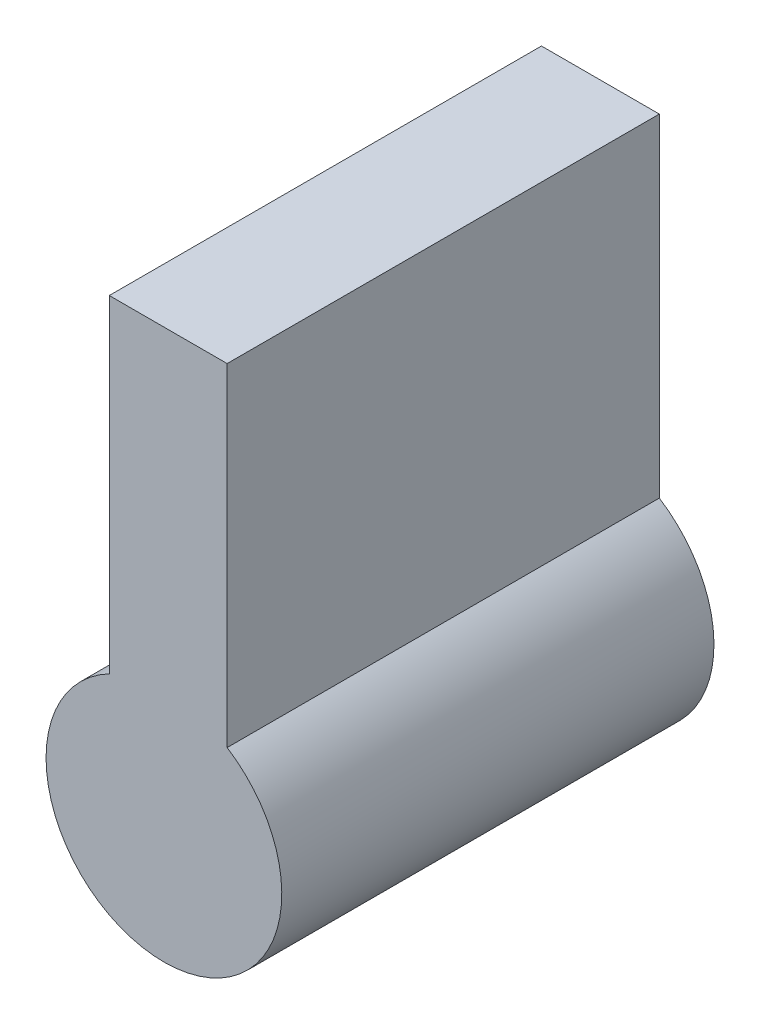
ISO-10303-21;
HEADER;
FILE_DESCRIPTION(('STEP AP214'),'2;1');
FILE_NAME('part.step','',(''),(''),'','','');
FILE_SCHEMA(('AUTOMOTIVE_DESIGN { 1 0 10303 214 1 1 1 1 }'));
ENDSEC;
DATA;
#1=APPLICATION_CONTEXT('core data for automotive mechanical design processes');
#2=APPLICATION_PROTOCOL_DEFINITION('international standard','automotive_design',2000,#1);
#3=PRODUCT_CONTEXT('',#1,'mechanical');
#4=PRODUCT('Part','Part','',(#3));
#5=PRODUCT_RELATED_PRODUCT_CATEGORY('part','',(#4));
#6=PRODUCT_DEFINITION_FORMATION('','',#4);
#7=PRODUCT_DEFINITION_CONTEXT('part definition',#1,'design');
#8=PRODUCT_DEFINITION('design','',#6,#7);
#9=PRODUCT_DEFINITION_SHAPE('','',#8);
#10=(LENGTH_UNIT() NAMED_UNIT(*) SI_UNIT(.MILLI.,.METRE.));
#11=(NAMED_UNIT(*) PLANE_ANGLE_UNIT() SI_UNIT($,.RADIAN.));
#12=(NAMED_UNIT(*) SI_UNIT($,.STERADIAN.) SOLID_ANGLE_UNIT());
#13=UNCERTAINTY_MEASURE_WITH_UNIT(LENGTH_MEASURE(1.E-05),#10,'distance_accuracy_value','');
#14=(GEOMETRIC_REPRESENTATION_CONTEXT(3) GLOBAL_UNCERTAINTY_ASSIGNED_CONTEXT((#13)) GLOBAL_UNIT_ASSIGNED_CONTEXT((#10,
#11,#12)) REPRESENTATION_CONTEXT('',''));
#15=CARTESIAN_POINT('',(0.,0.,0.));
#16=DIRECTION('',(0.,0.,1.));
#17=DIRECTION('',(1.,0.,0.));
#18=AXIS2_PLACEMENT_3D('',#15,#16,#17);
#19=CARTESIAN_POINT('',(0.,0.,0.));
#20=DIRECTION('',(0.,0.,1.));
#21=DIRECTION('',(1.,0.,0.));
#22=AXIS2_PLACEMENT_3D('',#19,#20,#21);
#23=PLANE('',#22);
#24=DIRECTION('',(0.,-1.,0.));
#25=VECTOR('',#24,1.);
#26=CARTESIAN_POINT('',(3.21844428003321,21.9940308081587,0.));
#27=LINE('',#26,#25);
#28=CARTESIAN_POINT('',(3.21844428003321,21.9940308081587,0.));
#29=VERTEX_POINT('',#28);
#30=CARTESIAN_POINT('',(3.21844428003321,5.06375516947001,0.));
#31=VERTEX_POINT('',#30);
#32=EDGE_CURVE('E119',#29,#31,#27,.T.);
#33=ORIENTED_EDGE('',*,*,#32,.T.);
#34=CARTESIAN_POINT('',(0.,0.,0.));
#35=DIRECTION('',(0.,0.,1.));
#36=DIRECTION('',(1.,0.,0.));
#37=AXIS2_PLACEMENT_3D('',#34,#35,#36);
#38=CIRCLE('',#37,6.00000000000106);
#39=CARTESIAN_POINT('',(-2.78155571996679,5.31629079121268,0.));
#40=VERTEX_POINT('',#39);
#41=EDGE_CURVE('E11',#40,#31,#38,.T.);
#42=ORIENTED_EDGE('',*,*,#41,.F.);
#43=DIRECTION('',(0.,1.,0.));
#44=VECTOR('',#43,1.);
#45=CARTESIAN_POINT('',(-2.78155571996679,3.99403080815869,0.));
#46=LINE('',#45,#44);
#47=CARTESIAN_POINT('',(-2.78155571996679,21.9940308081587,0.));
#48=VERTEX_POINT('',#47);
#49=EDGE_CURVE('E54',#40,#48,#46,.T.);
#50=ORIENTED_EDGE('',*,*,#49,.T.);
#51=DIRECTION('',(1.,0.,0.));
#52=VECTOR('',#51,1.);
#53=CARTESIAN_POINT('',(0.218444280033213,21.9940308081587,0.));
#54=LINE('',#53,#52);
#55=EDGE_CURVE('E120',#48,#29,#54,.T.);
#56=ORIENTED_EDGE('',*,*,#55,.T.);
#57=EDGE_LOOP('',(#33,#42,#50,#56));
#58=FACE_BOUND('',#57,.T.);
#59=DIRECTION('',(1.,0.,0.));
#60=VECTOR('',#59,1.);
#61=CARTESIAN_POINT('',(3.21844428003321,3.99403080815869,0.));
#62=LINE('',#61,#60);
#63=CARTESIAN_POINT('',(0.218444280033221,3.99403080815869,0.));
#64=VERTEX_POINT('',#63);
#65=CARTESIAN_POINT('',(-0.218444280033222,3.99403080815869,0.));
#66=VERTEX_POINT('',#65);
#67=EDGE_CURVE('E41',#64,#66,#62,.F.);
#68=ORIENTED_EDGE('',*,*,#67,.T.);
#69=CARTESIAN_POINT('',(0.,0.,0.));
#70=DIRECTION('',(0.,0.,1.));
#71=DIRECTION('',(1.,0.,0.));
#72=AXIS2_PLACEMENT_3D('',#69,#70,#71);
#73=CIRCLE('',#72,4.);
#74=EDGE_CURVE('E77',#66,#64,#73,.T.);
#75=ORIENTED_EDGE('',*,*,#74,.T.);
#76=EDGE_LOOP('',(#68,#75));
#77=FACE_BOUND('',#76,.T.);
#78=ADVANCED_FACE('F37',(#58,#77),#23,.F.);
#79=CARTESIAN_POINT('',(0.,0.,20.));
#80=DIRECTION('',(0.,0.,-1.));
#81=DIRECTION('',(-1.,0.,0.));
#82=AXIS2_PLACEMENT_3D('',#79,#80,#81);
#83=CYLINDRICAL_SURFACE('',#82,6.00000000000106);
#84=ORIENTED_EDGE('',*,*,#41,.T.);
#85=DIRECTION('',(0.,0.,-1.));
#86=VECTOR('',#85,1.);
#87=CARTESIAN_POINT('',(3.21844428003321,5.06375516947001,20.));
#88=LINE('',#87,#86);
#89=CARTESIAN_POINT('',(3.21844428003321,5.06375516947001,22.));
#90=VERTEX_POINT('',#89);
#91=EDGE_CURVE('E90',#31,#90,#88,.F.);
#92=ORIENTED_EDGE('',*,*,#91,.T.);
#93=CARTESIAN_POINT('',(0.,0.,22.));
#94=DIRECTION('',(0.,0.,1.));
#95=DIRECTION('',(1.,0.,0.));
#96=AXIS2_PLACEMENT_3D('',#93,#94,#95);
#97=CIRCLE('',#96,6.00000000000106);
#98=CARTESIAN_POINT('',(-2.78155571996679,5.31629079121268,22.));
#99=VERTEX_POINT('',#98);
#100=EDGE_CURVE('E93',#99,#90,#97,.T.);
#101=ORIENTED_EDGE('',*,*,#100,.F.);
#102=DIRECTION('',(0.,0.,-1.));
#103=VECTOR('',#102,1.);
#104=CARTESIAN_POINT('',(-2.78155571996679,5.31629079121268,20.));
#105=LINE('',#104,#103);
#106=EDGE_CURVE('E99',#99,#40,#105,.T.);
#107=ORIENTED_EDGE('',*,*,#106,.T.);
#108=EDGE_LOOP('',(#84,#92,#101,#107));
#109=FACE_BOUND('',#108,.T.);
#110=ADVANCED_FACE('F39',(#109),#83,.T.);
#111=CARTESIAN_POINT('',(0.,0.,20.));
#112=DIRECTION('',(0.,0.,-1.));
#113=DIRECTION('',(-1.,0.,0.));
#114=AXIS2_PLACEMENT_3D('',#111,#112,#113);
#115=CYLINDRICAL_SURFACE('',#114,4.);
#116=DIRECTION('',(0.,0.,-1.));
#117=VECTOR('',#116,1.);
#118=CARTESIAN_POINT('',(-0.218444280033222,3.99403080815869,20.));
#119=LINE('',#118,#117);
#120=CARTESIAN_POINT('',(-0.218444280033222,3.99403080815869,20.));
#121=VERTEX_POINT('',#120);
#122=EDGE_CURVE('E83',#121,#66,#119,.T.);
#123=ORIENTED_EDGE('',*,*,#122,.F.);
#124=CARTESIAN_POINT('',(0.,0.,20.));
#125=DIRECTION('',(0.,0.,1.));
#126=DIRECTION('',(1.,0.,0.));
#127=AXIS2_PLACEMENT_3D('',#124,#125,#126);
#128=CIRCLE('',#127,4.);
#129=CARTESIAN_POINT('',(0.218444280033221,3.99403080815869,20.));
#130=VERTEX_POINT('',#129);
#131=EDGE_CURVE('E79',#121,#130,#128,.T.);
#132=ORIENTED_EDGE('',*,*,#131,.T.);
#133=DIRECTION('',(0.,0.,-1.));
#134=VECTOR('',#133,1.);
#135=CARTESIAN_POINT('',(0.218444280033221,3.99403080815869,20.));
#136=LINE('',#135,#134);
#137=EDGE_CURVE('E73',#64,#130,#136,.F.);
#138=ORIENTED_EDGE('',*,*,#137,.F.);
#139=ORIENTED_EDGE('',*,*,#74,.F.);
#140=EDGE_LOOP('',(#123,#132,#138,#139));
#141=FACE_BOUND('',#140,.T.);
#142=ADVANCED_FACE('F76',(#141),#115,.F.);
#143=CARTESIAN_POINT('',(0.,0.,20.));
#144=DIRECTION('',(0.,0.,1.));
#145=DIRECTION('',(1.,0.,0.));
#146=AXIS2_PLACEMENT_3D('',#143,#144,#145);
#147=PLANE('',#146);
#148=ORIENTED_EDGE('',*,*,#131,.F.);
#149=DIRECTION('',(1.,0.,0.));
#150=VECTOR('',#149,1.);
#151=CARTESIAN_POINT('',(0.,3.99403080815869,20.));
#152=LINE('',#151,#150);
#153=EDGE_CURVE('E84',#121,#130,#152,.T.);
#154=ORIENTED_EDGE('',*,*,#153,.T.);
#155=EDGE_LOOP('',(#148,#154));
#156=FACE_BOUND('',#155,.T.);
#157=ADVANCED_FACE('F151',(#156),#147,.F.);
#158=CARTESIAN_POINT('',(0.,0.,22.));
#159=DIRECTION('',(0.,0.,1.));
#160=DIRECTION('',(1.,0.,0.));
#161=AXIS2_PLACEMENT_3D('',#158,#159,#160);
#162=PLANE('',#161);
#163=ORIENTED_EDGE('',*,*,#100,.T.);
#164=DIRECTION('',(0.,-1.,0.));
#165=VECTOR('',#164,1.);
#166=CARTESIAN_POINT('',(3.21844428003321,21.9940308081587,22.));
#167=LINE('',#166,#165);
#168=CARTESIAN_POINT('',(3.21844428003321,21.9940308081587,22.));
#169=VERTEX_POINT('',#168);
#170=EDGE_CURVE('E110',#169,#90,#167,.T.);
#171=ORIENTED_EDGE('',*,*,#170,.F.);
#172=DIRECTION('',(1.,0.,0.));
#173=VECTOR('',#172,1.);
#174=CARTESIAN_POINT('',(0.218444280033213,21.9940308081587,22.));
#175=LINE('',#174,#173);
#176=CARTESIAN_POINT('',(-2.78155571996679,21.9940308081587,22.));
#177=VERTEX_POINT('',#176);
#178=EDGE_CURVE('E111',#177,#169,#175,.T.);
#179=ORIENTED_EDGE('',*,*,#178,.F.);
#180=DIRECTION('',(0.,1.,0.));
#181=VECTOR('',#180,1.);
#182=CARTESIAN_POINT('',(-2.78155571996679,3.99403080815869,22.));
#183=LINE('',#182,#181);
#184=EDGE_CURVE('E105',#99,#177,#183,.T.);
#185=ORIENTED_EDGE('',*,*,#184,.F.);
#186=EDGE_LOOP('',(#163,#171,#179,#185));
#187=FACE_BOUND('',#186,.T.);
#188=ADVANCED_FACE('F146',(#187),#162,.T.);
#189=CARTESIAN_POINT('',(3.21844428003321,3.99403080815869,40.9736659610103));
#190=DIRECTION('',(0.,-1.,0.));
#191=DIRECTION('',(1.,0.,0.));
#192=AXIS2_PLACEMENT_3D('',#189,#190,#191);
#193=PLANE('',#192);
#194=ORIENTED_EDGE('',*,*,#153,.F.);
#195=ORIENTED_EDGE('',*,*,#122,.T.);
#196=ORIENTED_EDGE('',*,*,#67,.F.);
#197=ORIENTED_EDGE('',*,*,#137,.T.);
#198=EDGE_LOOP('',(#194,#195,#196,#197));
#199=FACE_BOUND('',#198,.T.);
#200=ADVANCED_FACE('F89',(#199),#193,.T.);
#201=CARTESIAN_POINT('',(3.21844428003321,21.9940308081587,40.9736659610103));
#202=DIRECTION('',(1.,0.,0.));
#203=DIRECTION('',(0.,1.,0.));
#204=AXIS2_PLACEMENT_3D('',#201,#202,#203);
#205=PLANE('',#204);
#206=ORIENTED_EDGE('',*,*,#91,.F.);
#207=ORIENTED_EDGE('',*,*,#32,.F.);
#208=DIRECTION('',(0.,0.,-1.));
#209=VECTOR('',#208,1.);
#210=CARTESIAN_POINT('',(3.21844428003321,21.9940308081587,40.9736659610103));
#211=LINE('',#210,#209);
#212=EDGE_CURVE('E108',#169,#29,#211,.T.);
#213=ORIENTED_EDGE('',*,*,#212,.F.);
#214=ORIENTED_EDGE('',*,*,#170,.T.);
#215=EDGE_LOOP('',(#206,#207,#213,#214));
#216=FACE_BOUND('',#215,.T.);
#217=ADVANCED_FACE('F143',(#216),#205,.T.);
#218=CARTESIAN_POINT('',(-2.78155571996679,3.99403080815869,40.9736659610103));
#219=DIRECTION('',(-1.,0.,0.));
#220=DIRECTION('',(0.,0.,1.));
#221=AXIS2_PLACEMENT_3D('',#218,#219,#220);
#222=PLANE('',#221);
#223=ORIENTED_EDGE('',*,*,#106,.F.);
#224=ORIENTED_EDGE('',*,*,#184,.T.);
#225=DIRECTION('',(0.,0.,-1.));
#226=VECTOR('',#225,1.);
#227=CARTESIAN_POINT('',(-2.78155571996679,21.9940308081587,40.9736659610103));
#228=LINE('',#227,#226);
#229=EDGE_CURVE('E101',#177,#48,#228,.T.);
#230=ORIENTED_EDGE('',*,*,#229,.T.);
#231=ORIENTED_EDGE('',*,*,#49,.F.);
#232=EDGE_LOOP('',(#223,#224,#230,#231));
#233=FACE_BOUND('',#232,.T.);
#234=ADVANCED_FACE('F131',(#233),#222,.T.);
#235=CARTESIAN_POINT('',(0.218444280033213,21.9940308081587,40.9736659610103));
#236=DIRECTION('',(0.,1.,0.));
#237=DIRECTION('',(0.,0.,1.));
#238=AXIS2_PLACEMENT_3D('',#235,#236,#237);
#239=PLANE('',#238);
#240=ORIENTED_EDGE('',*,*,#229,.F.);
#241=ORIENTED_EDGE('',*,*,#178,.T.);
#242=ORIENTED_EDGE('',*,*,#212,.T.);
#243=ORIENTED_EDGE('',*,*,#55,.F.);
#244=EDGE_LOOP('',(#240,#241,#242,#243));
#245=FACE_BOUND('',#244,.T.);
#246=ADVANCED_FACE('F136',(#245),#239,.T.);
#247=CLOSED_SHELL('',(#78,#110,#142,#157,#188,#200,#217,#234,#246));
#248=MANIFOLD_SOLID_BREP('B2',#247);
#249=ADVANCED_BREP_SHAPE_REPRESENTATION('',(#18,#248),#14);
#250=SHAPE_DEFINITION_REPRESENTATION(#9,#249);
ENDSEC;
END-ISO-10303-21;
